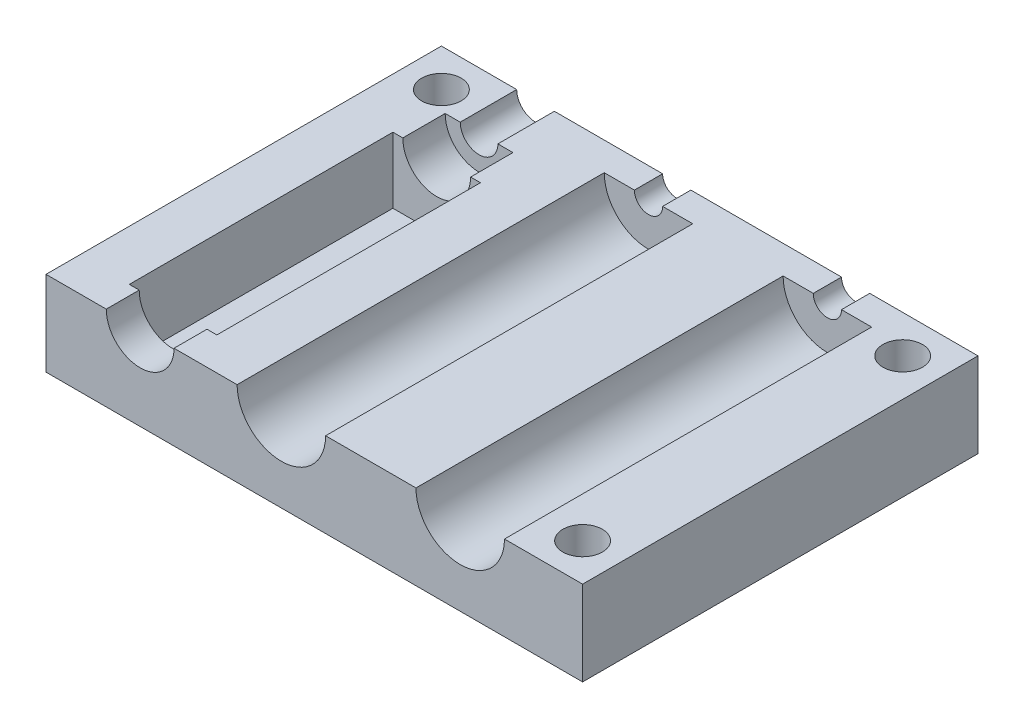
ISO-10303-21;
HEADER;
FILE_DESCRIPTION(('STEP AP214'),'2;1');
FILE_NAME('part.step','',(''),(''),'','','');
FILE_SCHEMA(('AUTOMOTIVE_DESIGN { 1 0 10303 214 1 1 1 1 }'));
ENDSEC;
DATA;
#1=APPLICATION_CONTEXT('core data for automotive mechanical design processes');
#2=APPLICATION_PROTOCOL_DEFINITION('international standard','automotive_design',2000,#1);
#3=PRODUCT_CONTEXT('',#1,'mechanical');
#4=PRODUCT('Part','Part','',(#3));
#5=PRODUCT_RELATED_PRODUCT_CATEGORY('part','',(#4));
#6=PRODUCT_DEFINITION_FORMATION('','',#4);
#7=PRODUCT_DEFINITION_CONTEXT('part definition',#1,'design');
#8=PRODUCT_DEFINITION('design','',#6,#7);
#9=PRODUCT_DEFINITION_SHAPE('','',#8);
#10=(LENGTH_UNIT() NAMED_UNIT(*) SI_UNIT(.MILLI.,.METRE.));
#11=(NAMED_UNIT(*) PLANE_ANGLE_UNIT() SI_UNIT($,.RADIAN.));
#12=(NAMED_UNIT(*) SI_UNIT($,.STERADIAN.) SOLID_ANGLE_UNIT());
#13=UNCERTAINTY_MEASURE_WITH_UNIT(LENGTH_MEASURE(1.E-05),#10,'distance_accuracy_value','');
#14=(GEOMETRIC_REPRESENTATION_CONTEXT(3) GLOBAL_UNCERTAINTY_ASSIGNED_CONTEXT((#13)) GLOBAL_UNIT_ASSIGNED_CONTEXT((#10,
#11,#12)) REPRESENTATION_CONTEXT('',''));
#15=CARTESIAN_POINT('',(0.,0.,0.));
#16=DIRECTION('',(0.,0.,1.));
#17=DIRECTION('',(1.,0.,0.));
#18=AXIS2_PLACEMENT_3D('',#15,#16,#17);
#19=CARTESIAN_POINT('',(-18.5,0.999999999999999,-39.));
#20=DIRECTION('',(0.,0.,1.));
#21=DIRECTION('',(1.,0.,0.));
#22=AXIS2_PLACEMENT_3D('',#19,#20,#21);
#23=CYLINDRICAL_SURFACE('',#22,3.6);
#24=CARTESIAN_POINT('',(-18.5,0.999999999999999,-36.));
#25=DIRECTION('',(0.,0.,-1.));
#26=DIRECTION('',(-1.,0.,0.));
#27=AXIS2_PLACEMENT_3D('',#24,#25,#26);
#28=CIRCLE('',#27,3.6);
#29=CARTESIAN_POINT('',(-22.1,0.999999999999999,-36.));
#30=VERTEX_POINT('',#29);
#31=CARTESIAN_POINT('',(-14.9,0.999999999999999,-36.));
#32=VERTEX_POINT('',#31);
#33=EDGE_CURVE('E262',#30,#32,#28,.F.);
#34=ORIENTED_EDGE('',*,*,#33,.F.);
#35=DIRECTION('',(0.,0.,1.));
#36=VECTOR('',#35,1.);
#37=CARTESIAN_POINT('',(-22.1,0.999999999999999,-39.));
#38=LINE('',#37,#36);
#39=CARTESIAN_POINT('',(-22.1,0.999999999999999,-31.5));
#40=VERTEX_POINT('',#39);
#41=EDGE_CURVE('E411',#30,#40,#38,.T.);
#42=ORIENTED_EDGE('',*,*,#41,.T.);
#43=CARTESIAN_POINT('',(-18.5,0.999999999999999,-31.5));
#44=DIRECTION('',(0.,0.,1.));
#45=DIRECTION('',(1.,0.,0.));
#46=AXIS2_PLACEMENT_3D('',#43,#44,#45);
#47=CIRCLE('',#46,3.6);
#48=CARTESIAN_POINT('',(-14.9,0.999999999999999,-31.5));
#49=VERTEX_POINT('',#48);
#50=EDGE_CURVE('E359',#49,#40,#47,.F.);
#51=ORIENTED_EDGE('',*,*,#50,.F.);
#52=DIRECTION('',(0.,0.,1.));
#53=VECTOR('',#52,1.);
#54=CARTESIAN_POINT('',(-14.9,0.999999999999999,-39.));
#55=LINE('',#54,#53);
#56=EDGE_CURVE('E415',#32,#49,#55,.T.);
#57=ORIENTED_EDGE('',*,*,#56,.F.);
#58=EDGE_LOOP('',(#34,#42,#51,#57));
#59=FACE_BOUND('',#58,.T.);
#60=ADVANCED_FACE('F42',(#59),#23,.F.);
#61=CARTESIAN_POINT('',(0.,0.999999999999999,-39.));
#62=DIRECTION('',(0.,-1.,0.));
#63=DIRECTION('',(0.,0.,-1.));
#64=AXIS2_PLACEMENT_3D('',#61,#62,#63);
#65=PLANE('',#64);
#66=CARTESIAN_POINT('',(-24.5,0.999999999999999,-38.));
#67=DIRECTION('',(0.,1.,0.));
#68=DIRECTION('',(0.,0.,1.));
#69=AXIS2_PLACEMENT_3D('',#66,#67,#68);
#70=CIRCLE('',#69,2.1);
#71=CARTESIAN_POINT('',(-24.5,0.999999999999999,-35.9));
#72=VERTEX_POINT('',#71);
#73=EDGE_CURVE('E560',#72,#72,#70,.T.);
#74=ORIENTED_EDGE('',*,*,#73,.F.);
#75=EDGE_LOOP('',(#74));
#76=FACE_BOUND('',#75,.T.);
#77=DIRECTION('',(0.,0.,1.));
#78=VECTOR('',#77,1.);
#79=CARTESIAN_POINT('',(-28.5,0.999999999999999,-39.));
#80=LINE('',#79,#78);
#81=CARTESIAN_POINT('',(-28.5,0.999999999999999,-42.));
#82=VERTEX_POINT('',#81);
#83=CARTESIAN_POINT('',(-28.5,0.999999999999999,0.));
#84=VERTEX_POINT('',#83);
#85=EDGE_CURVE('E214',#82,#84,#80,.T.);
#86=ORIENTED_EDGE('',*,*,#85,.T.);
#87=DIRECTION('',(1.,0.,0.));
#88=VECTOR('',#87,1.);
#89=CARTESIAN_POINT('',(0.,0.999999999999999,0.));
#90=LINE('',#89,#88);
#91=CARTESIAN_POINT('',(-22.1,0.999999999999999,0.));
#92=VERTEX_POINT('',#91);
#93=EDGE_CURVE('E386',#84,#92,#90,.T.);
#94=ORIENTED_EDGE('',*,*,#93,.T.);
#95=CARTESIAN_POINT('',(-22.1,0.999999999999999,-3.5));
#96=VERTEX_POINT('',#95);
#97=EDGE_CURVE('E414',#96,#92,#38,.T.);
#98=ORIENTED_EDGE('',*,*,#97,.F.);
#99=DIRECTION('',(1.,0.,0.));
#100=VECTOR('',#99,1.);
#101=CARTESIAN_POINT('',(0.,0.999999999999999,-3.5));
#102=LINE('',#101,#100);
#103=CARTESIAN_POINT('',(-23.15,0.999999999999999,-3.5));
#104=VERTEX_POINT('',#103);
#105=EDGE_CURVE('E338',#104,#96,#102,.T.);
#106=ORIENTED_EDGE('',*,*,#105,.F.);
#107=DIRECTION('',(0.,0.,1.));
#108=VECTOR('',#107,1.);
#109=CARTESIAN_POINT('',(-23.15,0.999999999999999,0.));
#110=LINE('',#109,#108);
#111=CARTESIAN_POINT('',(-23.15,0.999999999999999,-31.5));
#112=VERTEX_POINT('',#111);
#113=EDGE_CURVE('E334',#112,#104,#110,.T.);
#114=ORIENTED_EDGE('',*,*,#113,.F.);
#115=DIRECTION('',(1.,0.,0.));
#116=VECTOR('',#115,1.);
#117=CARTESIAN_POINT('',(0.,0.999999999999999,-31.5));
#118=LINE('',#117,#116);
#119=EDGE_CURVE('E313',#112,#40,#118,.T.);
#120=ORIENTED_EDGE('',*,*,#119,.T.);
#121=ORIENTED_EDGE('',*,*,#41,.F.);
#122=DIRECTION('',(1.,0.,0.));
#123=VECTOR('',#122,1.);
#124=CARTESIAN_POINT('',(0.,0.999999999999999,-36.));
#125=LINE('',#124,#123);
#126=CARTESIAN_POINT('',(-20.5,0.999999999999999,-36.));
#127=VERTEX_POINT('',#126);
#128=EDGE_CURVE('E249',#30,#127,#125,.T.);
#129=ORIENTED_EDGE('',*,*,#128,.T.);
#130=DIRECTION('',(0.,0.,1.));
#131=VECTOR('',#130,1.);
#132=CARTESIAN_POINT('',(-20.5,0.999999999999999,-42.));
#133=LINE('',#132,#131);
#134=CARTESIAN_POINT('',(-20.5,0.999999999999999,-42.));
#135=VERTEX_POINT('',#134);
#136=EDGE_CURVE('E258',#135,#127,#133,.T.);
#137=ORIENTED_EDGE('',*,*,#136,.F.);
#138=DIRECTION('',(1.,0.,0.));
#139=VECTOR('',#138,1.);
#140=CARTESIAN_POINT('',(0.,0.999999999999999,-42.));
#141=LINE('',#140,#139);
#142=EDGE_CURVE('E231',#82,#135,#141,.T.);
#143=ORIENTED_EDGE('',*,*,#142,.F.);
#144=EDGE_LOOP('',(#86,#94,#98,#106,#114,#120,#121,#129,#137,#143));
#145=FACE_BOUND('',#144,.T.);
#146=ADVANCED_FACE('F484',(#76,#145),#65,.F.);
#147=CARTESIAN_POINT('',(0.,0.999999999999999,-39.));
#148=DIRECTION('',(0.,-1.,0.));
#149=DIRECTION('',(0.,0.,-1.));
#150=AXIS2_PLACEMENT_3D('',#147,#148,#149);
#151=PLANE('',#150);
#152=DIRECTION('',(1.,0.,0.));
#153=VECTOR('',#152,1.);
#154=CARTESIAN_POINT('',(0.,0.999999999999999,-36.));
#155=LINE('',#154,#153);
#156=CARTESIAN_POINT('',(-16.5,0.999999999999999,-36.));
#157=VERTEX_POINT('',#156);
#158=EDGE_CURVE('E232',#157,#32,#155,.T.);
#159=ORIENTED_EDGE('',*,*,#158,.T.);
#160=ORIENTED_EDGE('',*,*,#56,.T.);
#161=DIRECTION('',(-1.,0.,0.));
#162=VECTOR('',#161,1.);
#163=CARTESIAN_POINT('',(0.,0.999999999999999,-31.5));
#164=LINE('',#163,#162);
#165=CARTESIAN_POINT('',(-13.85,0.999999999999999,-31.5));
#166=VERTEX_POINT('',#165);
#167=EDGE_CURVE('E12',#166,#49,#164,.T.);
#168=ORIENTED_EDGE('',*,*,#167,.F.);
#169=DIRECTION('',(0.,0.,1.));
#170=VECTOR('',#169,1.);
#171=CARTESIAN_POINT('',(-13.85,0.999999999999999,0.));
#172=LINE('',#171,#170);
#173=CARTESIAN_POINT('',(-13.85,0.999999999999999,-3.5));
#174=VERTEX_POINT('',#173);
#175=EDGE_CURVE('E319',#166,#174,#172,.T.);
#176=ORIENTED_EDGE('',*,*,#175,.T.);
#177=DIRECTION('',(-1.,0.,0.));
#178=VECTOR('',#177,1.);
#179=CARTESIAN_POINT('',(0.,0.999999999999999,-3.5));
#180=LINE('',#179,#178);
#181=CARTESIAN_POINT('',(-14.9,0.999999999999999,-3.5));
#182=VERTEX_POINT('',#181);
#183=EDGE_CURVE('E51',#174,#182,#180,.T.);
#184=ORIENTED_EDGE('',*,*,#183,.T.);
#185=CARTESIAN_POINT('',(-14.9,0.999999999999999,0.));
#186=VERTEX_POINT('',#185);
#187=EDGE_CURVE('E418',#182,#186,#55,.T.);
#188=ORIENTED_EDGE('',*,*,#187,.T.);
#189=DIRECTION('',(1.,0.,0.));
#190=VECTOR('',#189,1.);
#191=CARTESIAN_POINT('',(0.,0.999999999999999,0.));
#192=LINE('',#191,#190);
#193=CARTESIAN_POINT('',(-8.19999999999999,0.999999999999999,0.));
#194=VERTEX_POINT('',#193);
#195=EDGE_CURVE('E379',#186,#194,#192,.T.);
#196=ORIENTED_EDGE('',*,*,#195,.T.);
#197=DIRECTION('',(0.,0.,1.));
#198=VECTOR('',#197,1.);
#199=CARTESIAN_POINT('',(-8.19999999999999,0.999999999999999,-39.));
#200=LINE('',#199,#198);
#201=CARTESIAN_POINT('',(-8.19999999999999,0.999999999999999,-39.));
#202=VERTEX_POINT('',#201);
#203=EDGE_CURVE('E419',#202,#194,#200,.T.);
#204=ORIENTED_EDGE('',*,*,#203,.F.);
#205=DIRECTION('',(1.,0.,0.));
#206=VECTOR('',#205,1.);
#207=CARTESIAN_POINT('',(0.,0.999999999999999,-39.));
#208=LINE('',#207,#206);
#209=CARTESIAN_POINT('',(-4.99999999999999,0.999999999999999,-39.));
#210=VERTEX_POINT('',#209);
#211=EDGE_CURVE('E290',#202,#210,#208,.T.);
#212=ORIENTED_EDGE('',*,*,#211,.T.);
#213=DIRECTION('',(0.,0.,1.));
#214=VECTOR('',#213,1.);
#215=CARTESIAN_POINT('',(-4.99999999999999,0.999999999999999,-42.));
#216=LINE('',#215,#214);
#217=CARTESIAN_POINT('',(-4.99999999999999,0.999999999999999,-42.));
#218=VERTEX_POINT('',#217);
#219=EDGE_CURVE('E305',#218,#210,#216,.T.);
#220=ORIENTED_EDGE('',*,*,#219,.F.);
#221=DIRECTION('',(1.,0.,0.));
#222=VECTOR('',#221,1.);
#223=CARTESIAN_POINT('',(0.,0.999999999999999,-42.));
#224=LINE('',#223,#222);
#225=CARTESIAN_POINT('',(-16.5,0.999999999999999,-42.));
#226=VERTEX_POINT('',#225);
#227=EDGE_CURVE('E227',#226,#218,#224,.T.);
#228=ORIENTED_EDGE('',*,*,#227,.F.);
#229=DIRECTION('',(0.,0.,1.));
#230=VECTOR('',#229,1.);
#231=CARTESIAN_POINT('',(-16.5,0.999999999999999,-42.));
#232=LINE('',#231,#230);
#233=EDGE_CURVE('E248',#226,#157,#232,.T.);
#234=ORIENTED_EDGE('',*,*,#233,.T.);
#235=EDGE_LOOP('',(#159,#160,#168,#176,#184,#188,#196,#204,#212,#220,#228,#234));
#236=FACE_BOUND('',#235,.T.);
#237=ADVANCED_FACE('F431',(#236),#151,.F.);
#238=CARTESIAN_POINT('',(15.5,0.999999999999999,-39.));
#239=DIRECTION('',(0.,0.,1.));
#240=DIRECTION('',(1.,0.,0.));
#241=AXIS2_PLACEMENT_3D('',#238,#239,#240);
#242=CYLINDRICAL_SURFACE('',#241,4.7);
#243=CARTESIAN_POINT('',(15.5,0.999999999999999,0.));
#244=DIRECTION('',(0.,0.,1.));
#245=DIRECTION('',(1.,0.,0.));
#246=AXIS2_PLACEMENT_3D('',#243,#244,#245);
#247=CIRCLE('',#246,4.7);
#248=CARTESIAN_POINT('',(10.8,0.999999999999999,0.));
#249=VERTEX_POINT('',#248);
#250=CARTESIAN_POINT('',(20.2,0.999999999999999,0.));
#251=VERTEX_POINT('',#250);
#252=EDGE_CURVE('E363',#249,#251,#247,.T.);
#253=ORIENTED_EDGE('',*,*,#252,.T.);
#254=DIRECTION('',(0.,0.,1.));
#255=VECTOR('',#254,1.);
#256=CARTESIAN_POINT('',(20.2,0.999999999999999,-39.));
#257=LINE('',#256,#255);
#258=CARTESIAN_POINT('',(20.2,0.999999999999999,-39.));
#259=VERTEX_POINT('',#258);
#260=EDGE_CURVE('E67',#259,#251,#257,.T.);
#261=ORIENTED_EDGE('',*,*,#260,.F.);
#262=CARTESIAN_POINT('',(15.5,0.999999999999999,-39.));
#263=DIRECTION('',(0.,0.,1.));
#264=DIRECTION('',(1.,0.,0.));
#265=AXIS2_PLACEMENT_3D('',#262,#263,#264);
#266=CIRCLE('',#265,4.7);
#267=CARTESIAN_POINT('',(10.8,0.999999999999999,-39.));
#268=VERTEX_POINT('',#267);
#269=EDGE_CURVE('E364',#268,#259,#266,.T.);
#270=ORIENTED_EDGE('',*,*,#269,.F.);
#271=DIRECTION('',(0.,0.,1.));
#272=VECTOR('',#271,1.);
#273=CARTESIAN_POINT('',(10.8,0.999999999999999,-39.));
#274=LINE('',#273,#272);
#275=EDGE_CURVE('E113',#268,#249,#274,.T.);
#276=ORIENTED_EDGE('',*,*,#275,.T.);
#277=EDGE_LOOP('',(#253,#261,#270,#276));
#278=FACE_BOUND('',#277,.T.);
#279=ADVANCED_FACE('F44',(#278),#242,.F.);
#280=CARTESIAN_POINT('',(0.,0.999999999999999,-39.));
#281=DIRECTION('',(0.,-1.,0.));
#282=DIRECTION('',(0.,0.,-1.));
#283=AXIS2_PLACEMENT_3D('',#280,#281,#282);
#284=PLANE('',#283);
#285=CARTESIAN_POINT('',(24.5,0.999999999999999,-38.));
#286=DIRECTION('',(0.,1.,0.));
#287=DIRECTION('',(0.,0.,1.));
#288=AXIS2_PLACEMENT_3D('',#285,#286,#287);
#289=CIRCLE('',#288,2.1);
#290=CARTESIAN_POINT('',(24.5,0.999999999999999,-35.9));
#291=VERTEX_POINT('',#290);
#292=EDGE_CURVE('E551',#291,#291,#289,.T.);
#293=ORIENTED_EDGE('',*,*,#292,.F.);
#294=EDGE_LOOP('',(#293));
#295=FACE_BOUND('',#294,.T.);
#296=CARTESIAN_POINT('',(24.5,0.999999999999999,-4.));
#297=DIRECTION('',(0.,1.,0.));
#298=DIRECTION('',(0.,0.,1.));
#299=AXIS2_PLACEMENT_3D('',#296,#297,#298);
#300=CIRCLE('',#299,2.1);
#301=CARTESIAN_POINT('',(24.5,0.999999999999999,-1.9));
#302=VERTEX_POINT('',#301);
#303=EDGE_CURVE('E242',#302,#302,#300,.T.);
#304=ORIENTED_EDGE('',*,*,#303,.F.);
#305=EDGE_LOOP('',(#304));
#306=FACE_BOUND('',#305,.T.);
#307=DIRECTION('',(1.,0.,0.));
#308=VECTOR('',#307,1.);
#309=CARTESIAN_POINT('',(0.,0.999999999999999,0.));
#310=LINE('',#309,#308);
#311=CARTESIAN_POINT('',(28.5,0.999999999999999,0.));
#312=VERTEX_POINT('',#311);
#313=EDGE_CURVE('E107',#251,#312,#310,.T.);
#314=ORIENTED_EDGE('',*,*,#313,.T.);
#315=DIRECTION('',(0.,0.,1.));
#316=VECTOR('',#315,1.);
#317=CARTESIAN_POINT('',(28.5,0.999999999999999,-39.));
#318=LINE('',#317,#316);
#319=CARTESIAN_POINT('',(28.5,0.999999999999999,-42.));
#320=VERTEX_POINT('',#319);
#321=EDGE_CURVE('E403',#320,#312,#318,.T.);
#322=ORIENTED_EDGE('',*,*,#321,.F.);
#323=DIRECTION('',(-1.,0.,0.));
#324=VECTOR('',#323,1.);
#325=CARTESIAN_POINT('',(0.,0.999999999999999,-42.));
#326=LINE('',#325,#324);
#327=CARTESIAN_POINT('',(17.,0.999999999999999,-42.));
#328=VERTEX_POINT('',#327);
#329=EDGE_CURVE('E270',#320,#328,#326,.T.);
#330=ORIENTED_EDGE('',*,*,#329,.T.);
#331=DIRECTION('',(0.,0.,1.));
#332=VECTOR('',#331,1.);
#333=CARTESIAN_POINT('',(17.,0.999999999999999,-42.));
#334=LINE('',#333,#332);
#335=CARTESIAN_POINT('',(17.,0.999999999999999,-39.));
#336=VERTEX_POINT('',#335);
#337=EDGE_CURVE('E309',#328,#336,#334,.T.);
#338=ORIENTED_EDGE('',*,*,#337,.T.);
#339=DIRECTION('',(-1.,0.,0.));
#340=VECTOR('',#339,1.);
#341=CARTESIAN_POINT('',(0.,0.999999999999999,-39.));
#342=LINE('',#341,#340);
#343=EDGE_CURVE('E287',#259,#336,#342,.T.);
#344=ORIENTED_EDGE('',*,*,#343,.F.);
#345=ORIENTED_EDGE('',*,*,#260,.T.);
#346=EDGE_LOOP('',(#314,#322,#330,#338,#344,#345));
#347=FACE_BOUND('',#346,.T.);
#348=ADVANCED_FACE('F505',(#295,#306,#347),#284,.F.);
#349=CARTESIAN_POINT('',(28.5,0.,-39.));
#350=DIRECTION('',(-1.,0.,0.));
#351=DIRECTION('',(0.,0.,1.));
#352=AXIS2_PLACEMENT_3D('',#349,#350,#351);
#353=PLANE('',#352);
#354=DIRECTION('',(0.,-1.,0.));
#355=VECTOR('',#354,1.);
#356=CARTESIAN_POINT('',(28.5,0.,0.));
#357=LINE('',#356,#355);
#358=CARTESIAN_POINT('',(28.5,-8.,0.));
#359=VERTEX_POINT('',#358);
#360=EDGE_CURVE('E395',#312,#359,#357,.T.);
#361=ORIENTED_EDGE('',*,*,#360,.T.);
#362=DIRECTION('',(0.,0.,1.));
#363=VECTOR('',#362,1.);
#364=CARTESIAN_POINT('',(28.5,-8.,-39.));
#365=LINE('',#364,#363);
#366=CARTESIAN_POINT('',(28.5,-8.,-42.));
#367=VERTEX_POINT('',#366);
#368=EDGE_CURVE('E213',#367,#359,#365,.T.);
#369=ORIENTED_EDGE('',*,*,#368,.F.);
#370=DIRECTION('',(0.,-1.,0.));
#371=VECTOR('',#370,1.);
#372=CARTESIAN_POINT('',(28.5,0.,-42.));
#373=LINE('',#372,#371);
#374=EDGE_CURVE('E225',#320,#367,#373,.T.);
#375=ORIENTED_EDGE('',*,*,#374,.F.);
#376=ORIENTED_EDGE('',*,*,#321,.T.);
#377=EDGE_LOOP('',(#361,#369,#375,#376));
#378=FACE_BOUND('',#377,.T.);
#379=ADVANCED_FACE('F503',(#378),#353,.F.);
#380=CARTESIAN_POINT('',(0.,-8.,-39.));
#381=DIRECTION('',(0.,-1.,0.));
#382=DIRECTION('',(0.,0.,-1.));
#383=AXIS2_PLACEMENT_3D('',#380,#381,#382);
#384=PLANE('',#383);
#385=CARTESIAN_POINT('',(-24.5,-8.,-38.));
#386=DIRECTION('',(0.,1.,0.));
#387=DIRECTION('',(0.,0.,1.));
#388=AXIS2_PLACEMENT_3D('',#385,#386,#387);
#389=CIRCLE('',#388,2.1);
#390=CARTESIAN_POINT('',(-24.5,-8.,-35.9));
#391=VERTEX_POINT('',#390);
#392=EDGE_CURVE('E252',#391,#391,#389,.T.);
#393=ORIENTED_EDGE('',*,*,#392,.T.);
#394=EDGE_LOOP('',(#393));
#395=FACE_BOUND('',#394,.T.);
#396=CARTESIAN_POINT('',(24.5,-8.,-38.));
#397=DIRECTION('',(0.,1.,0.));
#398=DIRECTION('',(0.,0.,1.));
#399=AXIS2_PLACEMENT_3D('',#396,#397,#398);
#400=CIRCLE('',#399,2.1);
#401=CARTESIAN_POINT('',(24.5,-8.,-35.9));
#402=VERTEX_POINT('',#401);
#403=EDGE_CURVE('E545',#402,#402,#400,.T.);
#404=ORIENTED_EDGE('',*,*,#403,.T.);
#405=EDGE_LOOP('',(#404));
#406=FACE_BOUND('',#405,.T.);
#407=CARTESIAN_POINT('',(24.5,-8.,-4.));
#408=DIRECTION('',(0.,1.,0.));
#409=DIRECTION('',(0.,0.,1.));
#410=AXIS2_PLACEMENT_3D('',#407,#408,#409);
#411=CIRCLE('',#410,2.1);
#412=CARTESIAN_POINT('',(24.5,-8.,-1.9));
#413=VERTEX_POINT('',#412);
#414=EDGE_CURVE('E548',#413,#413,#411,.T.);
#415=ORIENTED_EDGE('',*,*,#414,.T.);
#416=EDGE_LOOP('',(#415));
#417=FACE_BOUND('',#416,.T.);
#418=DIRECTION('',(0.,0.,1.));
#419=VECTOR('',#418,1.);
#420=CARTESIAN_POINT('',(-28.5,-8.,-39.));
#421=LINE('',#420,#419);
#422=CARTESIAN_POINT('',(-28.5,-8.,-42.));
#423=VERTEX_POINT('',#422);
#424=CARTESIAN_POINT('',(-28.5,-8.,0.));
#425=VERTEX_POINT('',#424);
#426=EDGE_CURVE('E202',#423,#425,#421,.T.);
#427=ORIENTED_EDGE('',*,*,#426,.F.);
#428=DIRECTION('',(-1.,0.,0.));
#429=VECTOR('',#428,1.);
#430=CARTESIAN_POINT('',(0.,-8.,-42.));
#431=LINE('',#430,#429);
#432=EDGE_CURVE('E205',#367,#423,#431,.T.);
#433=ORIENTED_EDGE('',*,*,#432,.F.);
#434=ORIENTED_EDGE('',*,*,#368,.T.);
#435=DIRECTION('',(1.,0.,0.));
#436=VECTOR('',#435,1.);
#437=CARTESIAN_POINT('',(0.,-8.,0.));
#438=LINE('',#437,#436);
#439=EDGE_CURVE('E207',#425,#359,#438,.T.);
#440=ORIENTED_EDGE('',*,*,#439,.F.);
#441=EDGE_LOOP('',(#427,#433,#434,#440));
#442=FACE_BOUND('',#441,.T.);
#443=ADVANCED_FACE('F204',(#395,#406,#417,#442),#384,.T.);
#444=CARTESIAN_POINT('',(-28.5,0.,-39.));
#445=DIRECTION('',(-1.,0.,0.));
#446=DIRECTION('',(0.,0.,1.));
#447=AXIS2_PLACEMENT_3D('',#444,#445,#446);
#448=PLANE('',#447);
#449=ORIENTED_EDGE('',*,*,#426,.T.);
#450=DIRECTION('',(0.,-1.,0.));
#451=VECTOR('',#450,1.);
#452=CARTESIAN_POINT('',(-28.5,0.,0.));
#453=LINE('',#452,#451);
#454=EDGE_CURVE('E390',#84,#425,#453,.T.);
#455=ORIENTED_EDGE('',*,*,#454,.F.);
#456=ORIENTED_EDGE('',*,*,#85,.F.);
#457=DIRECTION('',(0.,1.,0.));
#458=VECTOR('',#457,1.);
#459=CARTESIAN_POINT('',(-28.5,0.,-42.));
#460=LINE('',#459,#458);
#461=EDGE_CURVE('E221',#423,#82,#460,.T.);
#462=ORIENTED_EDGE('',*,*,#461,.F.);
#463=EDGE_LOOP('',(#449,#455,#456,#462));
#464=FACE_BOUND('',#463,.T.);
#465=ADVANCED_FACE('F229',(#464),#448,.T.);
#466=ORIENTED_EDGE('',*,*,#187,.F.);
#467=CARTESIAN_POINT('',(-18.5,0.999999999999999,-3.5));
#468=DIRECTION('',(0.,0.,1.));
#469=DIRECTION('',(1.,0.,0.));
#470=AXIS2_PLACEMENT_3D('',#467,#468,#469);
#471=CIRCLE('',#470,3.6);
#472=EDGE_CURVE('E58',#182,#96,#471,.F.);
#473=ORIENTED_EDGE('',*,*,#472,.T.);
#474=ORIENTED_EDGE('',*,*,#97,.T.);
#475=CARTESIAN_POINT('',(-18.5,0.999999999999999,0.));
#476=DIRECTION('',(0.,0.,1.));
#477=DIRECTION('',(1.,0.,0.));
#478=AXIS2_PLACEMENT_3D('',#475,#476,#477);
#479=CIRCLE('',#478,3.6);
#480=EDGE_CURVE('E382',#92,#186,#479,.T.);
#481=ORIENTED_EDGE('',*,*,#480,.T.);
#482=EDGE_LOOP('',(#466,#473,#474,#481));
#483=FACE_BOUND('',#482,.T.);
#484=ADVANCED_FACE('F435',(#483),#23,.F.);
#485=CARTESIAN_POINT('',(-3.49999999999999,0.999999999999999,-39.));
#486=DIRECTION('',(0.,0.,1.));
#487=DIRECTION('',(1.,0.,0.));
#488=AXIS2_PLACEMENT_3D('',#485,#486,#487);
#489=CYLINDRICAL_SURFACE('',#488,4.7);
#490=CARTESIAN_POINT('',(-3.49999999999999,0.999999999999999,0.));
#491=DIRECTION('',(0.,0.,1.));
#492=DIRECTION('',(1.,0.,0.));
#493=AXIS2_PLACEMENT_3D('',#490,#491,#492);
#494=CIRCLE('',#493,4.7);
#495=CARTESIAN_POINT('',(1.20000000000001,0.999999999999999,0.));
#496=VERTEX_POINT('',#495);
#497=EDGE_CURVE('E376',#194,#496,#494,.T.);
#498=ORIENTED_EDGE('',*,*,#497,.T.);
#499=DIRECTION('',(0.,0.,1.));
#500=VECTOR('',#499,1.);
#501=CARTESIAN_POINT('',(1.20000000000001,0.999999999999999,-39.));
#502=LINE('',#501,#500);
#503=CARTESIAN_POINT('',(1.20000000000001,0.999999999999999,-39.));
#504=VERTEX_POINT('',#503);
#505=EDGE_CURVE('E423',#504,#496,#502,.T.);
#506=ORIENTED_EDGE('',*,*,#505,.F.);
#507=CARTESIAN_POINT('',(-3.49999999999999,0.999999999999999,-39.));
#508=DIRECTION('',(0.,0.,1.));
#509=DIRECTION('',(1.,0.,0.));
#510=AXIS2_PLACEMENT_3D('',#507,#508,#509);
#511=CIRCLE('',#510,4.7);
#512=EDGE_CURVE('E367',#202,#504,#511,.T.);
#513=ORIENTED_EDGE('',*,*,#512,.F.);
#514=ORIENTED_EDGE('',*,*,#203,.T.);
#515=EDGE_LOOP('',(#498,#506,#513,#514));
#516=FACE_BOUND('',#515,.T.);
#517=ADVANCED_FACE('F461',(#516),#489,.F.);
#518=CARTESIAN_POINT('',(0.,0.999999999999999,-39.));
#519=DIRECTION('',(0.,-1.,0.));
#520=DIRECTION('',(0.,0.,-1.));
#521=AXIS2_PLACEMENT_3D('',#518,#519,#520);
#522=PLANE('',#521);
#523=DIRECTION('',(1.,0.,0.));
#524=VECTOR('',#523,1.);
#525=CARTESIAN_POINT('',(0.,0.999999999999999,0.));
#526=LINE('',#525,#524);
#527=EDGE_CURVE('E373',#496,#249,#526,.T.);
#528=ORIENTED_EDGE('',*,*,#527,.T.);
#529=ORIENTED_EDGE('',*,*,#275,.F.);
#530=CARTESIAN_POINT('',(14.,0.999999999999999,-39.));
#531=VERTEX_POINT('',#530);
#532=EDGE_CURVE('E271',#531,#268,#342,.T.);
#533=ORIENTED_EDGE('',*,*,#532,.F.);
#534=DIRECTION('',(0.,0.,1.));
#535=VECTOR('',#534,1.);
#536=CARTESIAN_POINT('',(14.,0.999999999999999,-42.));
#537=LINE('',#536,#535);
#538=CARTESIAN_POINT('',(14.,0.999999999999999,-42.));
#539=VERTEX_POINT('',#538);
#540=EDGE_CURVE('E298',#539,#531,#537,.T.);
#541=ORIENTED_EDGE('',*,*,#540,.F.);
#542=CARTESIAN_POINT('',(-1.99999999999999,0.999999999999999,-42.));
#543=VERTEX_POINT('',#542);
#544=EDGE_CURVE('E275',#539,#543,#326,.T.);
#545=ORIENTED_EDGE('',*,*,#544,.T.);
#546=DIRECTION('',(0.,0.,1.));
#547=VECTOR('',#546,1.);
#548=CARTESIAN_POINT('',(-1.99999999999999,0.999999999999999,-42.));
#549=LINE('',#548,#547);
#550=CARTESIAN_POINT('',(-1.99999999999999,0.999999999999999,-39.));
#551=VERTEX_POINT('',#550);
#552=EDGE_CURVE('E301',#543,#551,#549,.T.);
#553=ORIENTED_EDGE('',*,*,#552,.T.);
#554=EDGE_CURVE('E291',#504,#551,#342,.T.);
#555=ORIENTED_EDGE('',*,*,#554,.F.);
#556=ORIENTED_EDGE('',*,*,#505,.T.);
#557=EDGE_LOOP('',(#528,#529,#533,#541,#545,#553,#555,#556));
#558=FACE_BOUND('',#557,.T.);
#559=ADVANCED_FACE('F452',(#558),#522,.F.);
#560=CARTESIAN_POINT('',(0.,0.,0.));
#561=DIRECTION('',(0.,0.,1.));
#562=DIRECTION('',(1.,0.,0.));
#563=AXIS2_PLACEMENT_3D('',#560,#561,#562);
#564=PLANE('',#563);
#565=ORIENTED_EDGE('',*,*,#252,.F.);
#566=ORIENTED_EDGE('',*,*,#527,.F.);
#567=ORIENTED_EDGE('',*,*,#497,.F.);
#568=ORIENTED_EDGE('',*,*,#195,.F.);
#569=ORIENTED_EDGE('',*,*,#480,.F.);
#570=ORIENTED_EDGE('',*,*,#93,.F.);
#571=ORIENTED_EDGE('',*,*,#454,.T.);
#572=ORIENTED_EDGE('',*,*,#439,.T.);
#573=ORIENTED_EDGE('',*,*,#360,.F.);
#574=ORIENTED_EDGE('',*,*,#313,.F.);
#575=EDGE_LOOP('',(#565,#566,#567,#568,#569,#570,#571,#572,#573,#574));
#576=FACE_BOUND('',#575,.T.);
#577=ADVANCED_FACE('F463',(#576),#564,.T.);
#578=CARTESIAN_POINT('',(0.,-6.,-31.5));
#579=DIRECTION('',(0.,0.,1.));
#580=DIRECTION('',(1.,0.,0.));
#581=AXIS2_PLACEMENT_3D('',#578,#579,#580);
#582=PLANE('',#581);
#583=ORIENTED_EDGE('',*,*,#50,.T.);
#584=ORIENTED_EDGE('',*,*,#119,.F.);
#585=DIRECTION('',(0.,1.,0.));
#586=VECTOR('',#585,1.);
#587=CARTESIAN_POINT('',(-23.15,-6.,-31.5));
#588=LINE('',#587,#586);
#589=CARTESIAN_POINT('',(-23.15,-6.,-31.5));
#590=VERTEX_POINT('',#589);
#591=EDGE_CURVE('E330',#590,#112,#588,.T.);
#592=ORIENTED_EDGE('',*,*,#591,.F.);
#593=DIRECTION('',(1.,0.,0.));
#594=VECTOR('',#593,1.);
#595=CARTESIAN_POINT('',(0.,-6.,-31.5));
#596=LINE('',#595,#594);
#597=CARTESIAN_POINT('',(-13.85,-6.,-31.5));
#598=VERTEX_POINT('',#597);
#599=EDGE_CURVE('E314',#590,#598,#596,.T.);
#600=ORIENTED_EDGE('',*,*,#599,.T.);
#601=DIRECTION('',(0.,1.,0.));
#602=VECTOR('',#601,1.);
#603=CARTESIAN_POINT('',(-13.85,-6.,-31.5));
#604=LINE('',#603,#602);
#605=EDGE_CURVE('E344',#598,#166,#604,.T.);
#606=ORIENTED_EDGE('',*,*,#605,.T.);
#607=ORIENTED_EDGE('',*,*,#167,.T.);
#608=EDGE_LOOP('',(#583,#584,#592,#600,#606,#607));
#609=FACE_BOUND('',#608,.T.);
#610=ADVANCED_FACE('F489',(#609),#582,.T.);
#611=CARTESIAN_POINT('',(0.,-6.,-3.5));
#612=DIRECTION('',(0.,0.,1.));
#613=DIRECTION('',(1.,0.,0.));
#614=AXIS2_PLACEMENT_3D('',#611,#612,#613);
#615=PLANE('',#614);
#616=ORIENTED_EDGE('',*,*,#183,.F.);
#617=DIRECTION('',(0.,1.,0.));
#618=VECTOR('',#617,1.);
#619=CARTESIAN_POINT('',(-13.85,-6.,-3.5));
#620=LINE('',#619,#618);
#621=CARTESIAN_POINT('',(-13.85,-6.,-3.5));
#622=VERTEX_POINT('',#621);
#623=EDGE_CURVE('E348',#622,#174,#620,.T.);
#624=ORIENTED_EDGE('',*,*,#623,.F.);
#625=DIRECTION('',(1.,0.,0.));
#626=VECTOR('',#625,1.);
#627=CARTESIAN_POINT('',(0.,-6.,-3.5));
#628=LINE('',#627,#626);
#629=CARTESIAN_POINT('',(-23.15,-6.,-3.5));
#630=VERTEX_POINT('',#629);
#631=EDGE_CURVE('E323',#630,#622,#628,.T.);
#632=ORIENTED_EDGE('',*,*,#631,.F.);
#633=DIRECTION('',(0.,1.,0.));
#634=VECTOR('',#633,1.);
#635=CARTESIAN_POINT('',(-23.15,-6.,-3.5));
#636=LINE('',#635,#634);
#637=EDGE_CURVE('E352',#630,#104,#636,.T.);
#638=ORIENTED_EDGE('',*,*,#637,.T.);
#639=ORIENTED_EDGE('',*,*,#105,.T.);
#640=ORIENTED_EDGE('',*,*,#472,.F.);
#641=EDGE_LOOP('',(#616,#624,#632,#638,#639,#640));
#642=FACE_BOUND('',#641,.T.);
#643=ADVANCED_FACE('F495',(#642),#615,.F.);
#644=CARTESIAN_POINT('',(-13.85,-6.,0.));
#645=DIRECTION('',(-1.,0.,0.));
#646=DIRECTION('',(0.,0.,1.));
#647=AXIS2_PLACEMENT_3D('',#644,#645,#646);
#648=PLANE('',#647);
#649=ORIENTED_EDGE('',*,*,#175,.F.);
#650=ORIENTED_EDGE('',*,*,#605,.F.);
#651=DIRECTION('',(0.,0.,1.));
#652=VECTOR('',#651,1.);
#653=CARTESIAN_POINT('',(-13.85,-6.,0.));
#654=LINE('',#653,#652);
#655=EDGE_CURVE('E327',#598,#622,#654,.T.);
#656=ORIENTED_EDGE('',*,*,#655,.T.);
#657=ORIENTED_EDGE('',*,*,#623,.T.);
#658=EDGE_LOOP('',(#649,#650,#656,#657));
#659=FACE_BOUND('',#658,.T.);
#660=ADVANCED_FACE('F493',(#659),#648,.T.);
#661=CARTESIAN_POINT('',(-23.15,-6.,0.));
#662=DIRECTION('',(-1.,0.,0.));
#663=DIRECTION('',(0.,0.,1.));
#664=AXIS2_PLACEMENT_3D('',#661,#662,#663);
#665=PLANE('',#664);
#666=ORIENTED_EDGE('',*,*,#113,.T.);
#667=ORIENTED_EDGE('',*,*,#637,.F.);
#668=DIRECTION('',(0.,0.,1.));
#669=VECTOR('',#668,1.);
#670=CARTESIAN_POINT('',(-23.15,-6.,0.));
#671=LINE('',#670,#669);
#672=EDGE_CURVE('E318',#590,#630,#671,.T.);
#673=ORIENTED_EDGE('',*,*,#672,.F.);
#674=ORIENTED_EDGE('',*,*,#591,.T.);
#675=EDGE_LOOP('',(#666,#667,#673,#674));
#676=FACE_BOUND('',#675,.T.);
#677=ADVANCED_FACE('F500',(#676),#665,.F.);
#678=CARTESIAN_POINT('',(0.,-6.,0.));
#679=DIRECTION('',(0.,1.,0.));
#680=DIRECTION('',(0.,0.,1.));
#681=AXIS2_PLACEMENT_3D('',#678,#679,#680);
#682=PLANE('',#681);
#683=ORIENTED_EDGE('',*,*,#599,.F.);
#684=ORIENTED_EDGE('',*,*,#672,.T.);
#685=ORIENTED_EDGE('',*,*,#631,.T.);
#686=ORIENTED_EDGE('',*,*,#655,.F.);
#687=EDGE_LOOP('',(#683,#684,#685,#686));
#688=FACE_BOUND('',#687,.T.);
#689=ADVANCED_FACE('F497',(#688),#682,.T.);
#690=CARTESIAN_POINT('',(0.,0.,-39.));
#691=DIRECTION('',(0.,0.,-1.));
#692=DIRECTION('',(-1.,0.,0.));
#693=AXIS2_PLACEMENT_3D('',#690,#691,#692);
#694=PLANE('',#693);
#695=ORIENTED_EDGE('',*,*,#532,.T.);
#696=ORIENTED_EDGE('',*,*,#269,.T.);
#697=ORIENTED_EDGE('',*,*,#343,.T.);
#698=CARTESIAN_POINT('',(15.5,0.999999999999999,-39.));
#699=DIRECTION('',(0.,0.,-1.));
#700=DIRECTION('',(-1.,0.,0.));
#701=AXIS2_PLACEMENT_3D('',#698,#699,#700);
#702=CIRCLE('',#701,1.5);
#703=EDGE_CURVE('E265',#336,#531,#702,.T.);
#704=ORIENTED_EDGE('',*,*,#703,.T.);
#705=EDGE_LOOP('',(#695,#696,#697,#704));
#706=FACE_BOUND('',#705,.T.);
#707=ADVANCED_FACE('F466',(#706),#694,.F.);
#708=ORIENTED_EDGE('',*,*,#211,.F.);
#709=ORIENTED_EDGE('',*,*,#512,.T.);
#710=ORIENTED_EDGE('',*,*,#554,.T.);
#711=CARTESIAN_POINT('',(-3.49999999999999,0.999999999999999,-39.));
#712=DIRECTION('',(0.,0.,-1.));
#713=DIRECTION('',(-1.,0.,0.));
#714=AXIS2_PLACEMENT_3D('',#711,#712,#713);
#715=CIRCLE('',#714,1.5);
#716=EDGE_CURVE('E294',#551,#210,#715,.T.);
#717=ORIENTED_EDGE('',*,*,#716,.T.);
#718=EDGE_LOOP('',(#708,#709,#710,#717));
#719=FACE_BOUND('',#718,.T.);
#720=ADVANCED_FACE('F449',(#719),#694,.F.);
#721=CARTESIAN_POINT('',(15.5,0.999999999999999,-42.));
#722=DIRECTION('',(0.,0.,1.));
#723=DIRECTION('',(1.,0.,0.));
#724=AXIS2_PLACEMENT_3D('',#721,#722,#723);
#725=CYLINDRICAL_SURFACE('',#724,1.5);
#726=ORIENTED_EDGE('',*,*,#703,.F.);
#727=ORIENTED_EDGE('',*,*,#337,.F.);
#728=CARTESIAN_POINT('',(15.5,0.999999999999999,-42.));
#729=DIRECTION('',(0.,0.,-1.));
#730=DIRECTION('',(-1.,0.,0.));
#731=AXIS2_PLACEMENT_3D('',#728,#729,#730);
#732=CIRCLE('',#731,1.5);
#733=EDGE_CURVE('E266',#328,#539,#732,.T.);
#734=ORIENTED_EDGE('',*,*,#733,.T.);
#735=ORIENTED_EDGE('',*,*,#540,.T.);
#736=EDGE_LOOP('',(#726,#727,#734,#735));
#737=FACE_BOUND('',#736,.T.);
#738=ADVANCED_FACE('F469',(#737),#725,.F.);
#739=CARTESIAN_POINT('',(-3.49999999999999,0.999999999999999,-42.));
#740=DIRECTION('',(0.,0.,1.));
#741=DIRECTION('',(1.,0.,0.));
#742=AXIS2_PLACEMENT_3D('',#739,#740,#741);
#743=CYLINDRICAL_SURFACE('',#742,1.5);
#744=ORIENTED_EDGE('',*,*,#716,.F.);
#745=ORIENTED_EDGE('',*,*,#552,.F.);
#746=CARTESIAN_POINT('',(-3.49999999999999,0.999999999999999,-42.));
#747=DIRECTION('',(0.,0.,-1.));
#748=DIRECTION('',(-1.,0.,0.));
#749=AXIS2_PLACEMENT_3D('',#746,#747,#748);
#750=CIRCLE('',#749,1.5);
#751=EDGE_CURVE('E280',#543,#218,#750,.T.);
#752=ORIENTED_EDGE('',*,*,#751,.T.);
#753=ORIENTED_EDGE('',*,*,#219,.T.);
#754=EDGE_LOOP('',(#744,#745,#752,#753));
#755=FACE_BOUND('',#754,.T.);
#756=ADVANCED_FACE('F456',(#755),#743,.F.);
#757=CARTESIAN_POINT('',(0.,0.,-42.));
#758=DIRECTION('',(0.,0.,-1.));
#759=DIRECTION('',(-1.,0.,0.));
#760=AXIS2_PLACEMENT_3D('',#757,#758,#759);
#761=PLANE('',#760);
#762=ORIENTED_EDGE('',*,*,#733,.F.);
#763=ORIENTED_EDGE('',*,*,#329,.F.);
#764=ORIENTED_EDGE('',*,*,#374,.T.);
#765=ORIENTED_EDGE('',*,*,#432,.T.);
#766=ORIENTED_EDGE('',*,*,#461,.T.);
#767=ORIENTED_EDGE('',*,*,#142,.T.);
#768=CARTESIAN_POINT('',(-18.5,0.999999999999999,-42.));
#769=DIRECTION('',(0.,0.,-1.));
#770=DIRECTION('',(-1.,0.,0.));
#771=AXIS2_PLACEMENT_3D('',#768,#769,#770);
#772=CIRCLE('',#771,2.);
#773=EDGE_CURVE('E236',#226,#135,#772,.T.);
#774=ORIENTED_EDGE('',*,*,#773,.F.);
#775=ORIENTED_EDGE('',*,*,#227,.T.);
#776=ORIENTED_EDGE('',*,*,#751,.F.);
#777=ORIENTED_EDGE('',*,*,#544,.F.);
#778=EDGE_LOOP('',(#762,#763,#764,#765,#766,#767,#774,#775,#776,#777));
#779=FACE_BOUND('',#778,.T.);
#780=ADVANCED_FACE('F220',(#779),#761,.T.);
#781=CARTESIAN_POINT('',(0.,0.,-36.));
#782=DIRECTION('',(0.,0.,-1.));
#783=DIRECTION('',(-1.,0.,0.));
#784=AXIS2_PLACEMENT_3D('',#781,#782,#783);
#785=PLANE('',#784);
#786=ORIENTED_EDGE('',*,*,#128,.F.);
#787=ORIENTED_EDGE('',*,*,#33,.T.);
#788=ORIENTED_EDGE('',*,*,#158,.F.);
#789=CARTESIAN_POINT('',(-18.5,0.999999999999999,-36.));
#790=DIRECTION('',(0.,0.,-1.));
#791=DIRECTION('',(-1.,0.,0.));
#792=AXIS2_PLACEMENT_3D('',#789,#790,#791);
#793=CIRCLE('',#792,2.);
#794=EDGE_CURVE('E239',#157,#127,#793,.T.);
#795=ORIENTED_EDGE('',*,*,#794,.T.);
#796=EDGE_LOOP('',(#786,#787,#788,#795));
#797=FACE_BOUND('',#796,.T.);
#798=ADVANCED_FACE('F478',(#797),#785,.F.);
#799=CARTESIAN_POINT('',(-18.5,0.999999999999999,-42.));
#800=DIRECTION('',(0.,0.,1.));
#801=DIRECTION('',(1.,0.,0.));
#802=AXIS2_PLACEMENT_3D('',#799,#800,#801);
#803=CYLINDRICAL_SURFACE('',#802,2.);
#804=ORIENTED_EDGE('',*,*,#794,.F.);
#805=ORIENTED_EDGE('',*,*,#233,.F.);
#806=ORIENTED_EDGE('',*,*,#773,.T.);
#807=ORIENTED_EDGE('',*,*,#136,.T.);
#808=EDGE_LOOP('',(#804,#805,#806,#807));
#809=FACE_BOUND('',#808,.T.);
#810=ADVANCED_FACE('F474',(#809),#803,.F.);
#811=CARTESIAN_POINT('',(24.5,-8.,-4.));
#812=DIRECTION('',(0.,1.,0.));
#813=DIRECTION('',(0.,0.,1.));
#814=AXIS2_PLACEMENT_3D('',#811,#812,#813);
#815=CYLINDRICAL_SURFACE('',#814,2.1);
#816=ORIENTED_EDGE('',*,*,#414,.F.);
#817=EDGE_LOOP('',(#816));
#818=FACE_BOUND('',#817,.T.);
#819=ORIENTED_EDGE('',*,*,#303,.T.);
#820=EDGE_LOOP('',(#819));
#821=FACE_BOUND('',#820,.T.);
#822=ADVANCED_FACE('F575',(#818,#821),#815,.F.);
#823=CARTESIAN_POINT('',(24.5,-8.,-38.));
#824=DIRECTION('',(0.,1.,0.));
#825=DIRECTION('',(0.,0.,1.));
#826=AXIS2_PLACEMENT_3D('',#823,#824,#825);
#827=CYLINDRICAL_SURFACE('',#826,2.1);
#828=ORIENTED_EDGE('',*,*,#403,.F.);
#829=EDGE_LOOP('',(#828));
#830=FACE_BOUND('',#829,.T.);
#831=ORIENTED_EDGE('',*,*,#292,.T.);
#832=EDGE_LOOP('',(#831));
#833=FACE_BOUND('',#832,.T.);
#834=ADVANCED_FACE('F569',(#830,#833),#827,.F.);
#835=CARTESIAN_POINT('',(-24.5,-8.,-38.));
#836=DIRECTION('',(0.,1.,0.));
#837=DIRECTION('',(0.,0.,1.));
#838=AXIS2_PLACEMENT_3D('',#835,#836,#837);
#839=CYLINDRICAL_SURFACE('',#838,2.1);
#840=ORIENTED_EDGE('',*,*,#392,.F.);
#841=EDGE_LOOP('',(#840));
#842=FACE_BOUND('',#841,.T.);
#843=ORIENTED_EDGE('',*,*,#73,.T.);
#844=EDGE_LOOP('',(#843));
#845=FACE_BOUND('',#844,.T.);
#846=ADVANCED_FACE('F567',(#842,#845),#839,.F.);
#847=CLOSED_SHELL('',(#60,#146,#237,#279,#348,#379,#443,#465,#484,#517,#559,#577,#610,#643,#660,
#677,#689,#707,#720,#738,#756,#780,#798,#810,#822,#834,#846));
#848=MANIFOLD_SOLID_BREP('B2',#847);
#849=ADVANCED_BREP_SHAPE_REPRESENTATION('',(#18,#848),#14);
#850=SHAPE_DEFINITION_REPRESENTATION(#9,#849);
ENDSEC;
END-ISO-10303-21;
